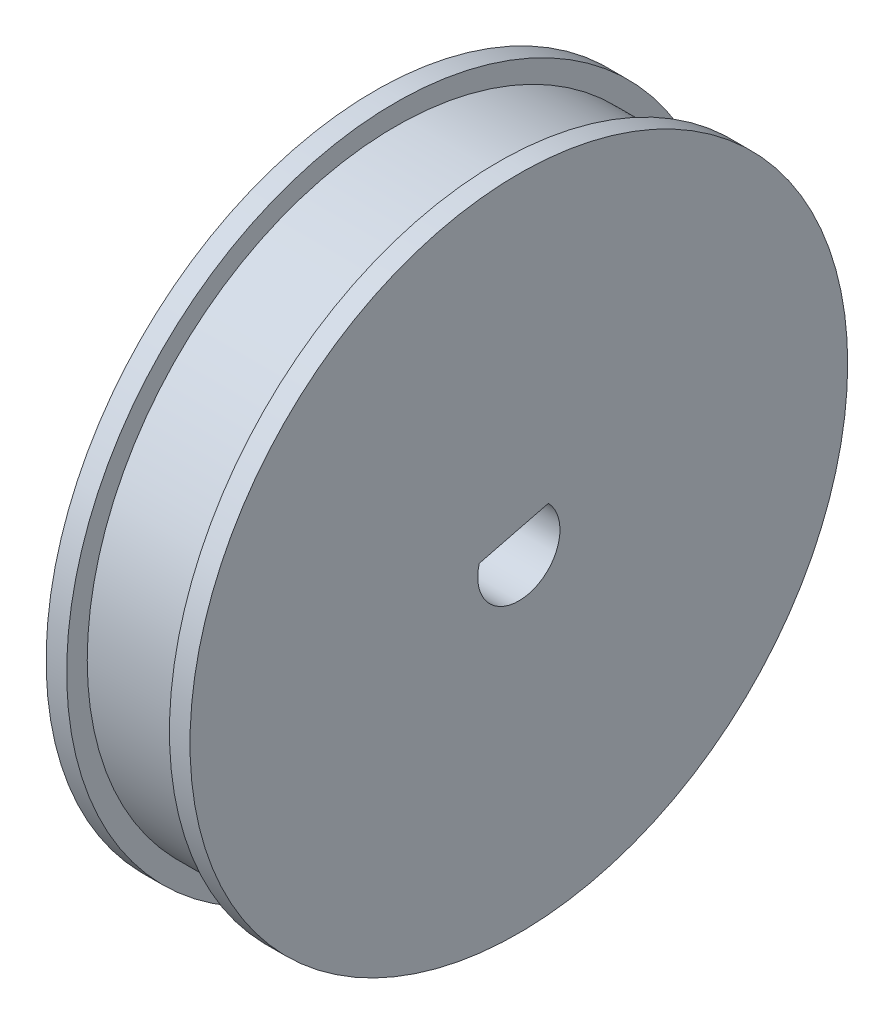
ISO-10303-21;
HEADER;
FILE_DESCRIPTION(('STEP AP214'),'2;1');
FILE_NAME('part.step','',(''),(''),'','','');
FILE_SCHEMA(('AUTOMOTIVE_DESIGN { 1 0 10303 214 1 1 1 1 }'));
ENDSEC;
DATA;
#1=APPLICATION_CONTEXT('core data for automotive mechanical design processes');
#2=APPLICATION_PROTOCOL_DEFINITION('international standard','automotive_design',2000,#1);
#3=PRODUCT_CONTEXT('',#1,'mechanical');
#4=PRODUCT('Part','Part','',(#3));
#5=PRODUCT_RELATED_PRODUCT_CATEGORY('part','',(#4));
#6=PRODUCT_DEFINITION_FORMATION('','',#4);
#7=PRODUCT_DEFINITION_CONTEXT('part definition',#1,'design');
#8=PRODUCT_DEFINITION('design','',#6,#7);
#9=PRODUCT_DEFINITION_SHAPE('','',#8);
#10=(LENGTH_UNIT() NAMED_UNIT(*) SI_UNIT(.MILLI.,.METRE.));
#11=(NAMED_UNIT(*) PLANE_ANGLE_UNIT() SI_UNIT($,.RADIAN.));
#12=(NAMED_UNIT(*) SI_UNIT($,.STERADIAN.) SOLID_ANGLE_UNIT());
#13=UNCERTAINTY_MEASURE_WITH_UNIT(LENGTH_MEASURE(1.E-05),#10,'distance_accuracy_value','');
#14=(GEOMETRIC_REPRESENTATION_CONTEXT(3) GLOBAL_UNCERTAINTY_ASSIGNED_CONTEXT((#13)) GLOBAL_UNIT_ASSIGNED_CONTEXT((#10,
#11,#12)) REPRESENTATION_CONTEXT('',''));
#15=CARTESIAN_POINT('',(0.,0.,0.));
#16=DIRECTION('',(0.,0.,1.));
#17=DIRECTION('',(1.,0.,0.));
#18=AXIS2_PLACEMENT_3D('',#15,#16,#17);
#19=CARTESIAN_POINT('',(7.,0.,0.));
#20=DIRECTION('',(-1.,0.,0.));
#21=DIRECTION('',(0.,0.,1.));
#22=AXIS2_PLACEMENT_3D('',#19,#20,#21);
#23=CYLINDRICAL_SURFACE('',#22,16.);
#24=CARTESIAN_POINT('',(0.,0.,0.));
#25=DIRECTION('',(1.,0.,0.));
#26=DIRECTION('',(0.,0.,-1.));
#27=AXIS2_PLACEMENT_3D('',#24,#25,#26);
#28=CIRCLE('',#27,16.);
#29=CARTESIAN_POINT('',(0.,0.,-16.));
#30=VERTEX_POINT('',#29);
#31=EDGE_CURVE('E45',#30,#30,#28,.T.);
#32=ORIENTED_EDGE('',*,*,#31,.T.);
#33=EDGE_LOOP('',(#32));
#34=FACE_BOUND('',#33,.T.);
#35=CARTESIAN_POINT('',(1.,0.,0.));
#36=DIRECTION('',(1.,0.,0.));
#37=DIRECTION('',(0.,0.,-1.));
#38=AXIS2_PLACEMENT_3D('',#35,#36,#37);
#39=CIRCLE('',#38,16.);
#40=CARTESIAN_POINT('',(1.,0.,-16.));
#41=VERTEX_POINT('',#40);
#42=EDGE_CURVE('E84',#41,#41,#39,.T.);
#43=ORIENTED_EDGE('',*,*,#42,.F.);
#44=EDGE_LOOP('',(#43));
#45=FACE_BOUND('',#44,.T.);
#46=ADVANCED_FACE('F41',(#34,#45),#23,.T.);
#47=CARTESIAN_POINT('',(7.,0.,0.));
#48=DIRECTION('',(1.,0.,0.));
#49=DIRECTION('',(0.,0.,-1.));
#50=AXIS2_PLACEMENT_3D('',#47,#48,#49);
#51=PLANE('',#50);
#52=CARTESIAN_POINT('',(7.,0.,0.));
#53=DIRECTION('',(1.,0.,0.));
#54=DIRECTION('',(0.,0.,-1.));
#55=AXIS2_PLACEMENT_3D('',#52,#53,#54);
#56=CIRCLE('',#55,16.);
#57=CARTESIAN_POINT('',(7.,0.,-16.));
#58=VERTEX_POINT('',#57);
#59=EDGE_CURVE('E11',#58,#58,#56,.T.);
#60=ORIENTED_EDGE('',*,*,#59,.T.);
#61=EDGE_LOOP('',(#60));
#62=FACE_BOUND('',#61,.T.);
#63=DIRECTION('',(0.,-0.244412301162042,0.969671401579254));
#64=VECTOR('',#63,1.);
#65=CARTESIAN_POINT('',(7.,0.546336877971772,1.92393243534383));
#66=LINE('',#65,#64);
#67=CARTESIAN_POINT('',(7.,1.39300592518674,-1.43510783301975));
#68=VERTEX_POINT('',#67);
#69=CARTESIAN_POINT('',(7.,0.546336877971772,1.92393243534383));
#70=VERTEX_POINT('',#69);
#71=EDGE_CURVE('E91',#68,#70,#66,.T.);
#72=ORIENTED_EDGE('',*,*,#71,.F.);
#73=CARTESIAN_POINT('',(7.,0.,0.));
#74=DIRECTION('',(1.,0.,0.));
#75=DIRECTION('',(0.,0.,-1.));
#76=AXIS2_PLACEMENT_3D('',#73,#74,#75);
#77=CIRCLE('',#76,2.);
#78=EDGE_CURVE('E75',#70,#68,#77,.T.);
#79=ORIENTED_EDGE('',*,*,#78,.F.);
#80=EDGE_LOOP('',(#72,#79));
#81=FACE_BOUND('',#80,.T.);
#82=ADVANCED_FACE('F121',(#62,#81),#51,.T.);
#83=CARTESIAN_POINT('',(0.,0.,0.));
#84=DIRECTION('',(1.,0.,0.));
#85=DIRECTION('',(0.,0.,-1.));
#86=AXIS2_PLACEMENT_3D('',#83,#84,#85);
#87=PLANE('',#86);
#88=ORIENTED_EDGE('',*,*,#31,.F.);
#89=EDGE_LOOP('',(#88));
#90=FACE_BOUND('',#89,.T.);
#91=CARTESIAN_POINT('',(0.,0.,0.));
#92=DIRECTION('',(1.,0.,0.));
#93=DIRECTION('',(0.,0.,-1.));
#94=AXIS2_PLACEMENT_3D('',#91,#92,#93);
#95=CIRCLE('',#94,2.);
#96=CARTESIAN_POINT('',(0.,0.546336877971772,1.92393243534383));
#97=VERTEX_POINT('',#96);
#98=CARTESIAN_POINT('',(0.,1.39300592518674,-1.43510783301975));
#99=VERTEX_POINT('',#98);
#100=EDGE_CURVE('E64',#97,#99,#95,.T.);
#101=ORIENTED_EDGE('',*,*,#100,.T.);
#102=DIRECTION('',(0.,-0.244412301162042,0.969671401579254));
#103=VECTOR('',#102,1.);
#104=CARTESIAN_POINT('',(0.,0.546336877971772,1.92393243534383));
#105=LINE('',#104,#103);
#106=EDGE_CURVE('E70',#99,#97,#105,.T.);
#107=ORIENTED_EDGE('',*,*,#106,.T.);
#108=EDGE_LOOP('',(#101,#107));
#109=FACE_BOUND('',#108,.T.);
#110=ADVANCED_FACE('F82',(#90,#109),#87,.F.);
#111=CARTESIAN_POINT('',(6.,0.,0.));
#112=DIRECTION('',(1.,0.,0.));
#113=DIRECTION('',(0.,0.,-1.));
#114=AXIS2_PLACEMENT_3D('',#111,#112,#113);
#115=CIRCLE('',#114,16.);
#116=CARTESIAN_POINT('',(6.,0.,-16.));
#117=VERTEX_POINT('',#116);
#118=EDGE_CURVE('E88',#117,#117,#115,.T.);
#119=ORIENTED_EDGE('',*,*,#118,.T.);
#120=EDGE_LOOP('',(#119));
#121=FACE_BOUND('',#120,.T.);
#122=ORIENTED_EDGE('',*,*,#59,.F.);
#123=EDGE_LOOP('',(#122));
#124=FACE_BOUND('',#123,.T.);
#125=ADVANCED_FACE('F43',(#121,#124),#23,.T.);
#126=CARTESIAN_POINT('',(7.,0.,0.));
#127=DIRECTION('',(-1.,0.,0.));
#128=DIRECTION('',(0.,0.,1.));
#129=AXIS2_PLACEMENT_3D('',#126,#127,#128);
#130=CYLINDRICAL_SURFACE('',#129,2.);
#131=ORIENTED_EDGE('',*,*,#100,.F.);
#132=DIRECTION('',(-1.,0.,0.));
#133=VECTOR('',#132,1.);
#134=CARTESIAN_POINT('',(7.,0.546336877971772,1.92393243534383));
#135=LINE('',#134,#133);
#136=EDGE_CURVE('E72',#70,#97,#135,.T.);
#137=ORIENTED_EDGE('',*,*,#136,.F.);
#138=ORIENTED_EDGE('',*,*,#78,.T.);
#139=DIRECTION('',(-1.,0.,0.));
#140=VECTOR('',#139,1.);
#141=CARTESIAN_POINT('',(7.,1.39300592518674,-1.43510783301975));
#142=LINE('',#141,#140);
#143=EDGE_CURVE('E57',#68,#99,#142,.T.);
#144=ORIENTED_EDGE('',*,*,#143,.T.);
#145=EDGE_LOOP('',(#131,#137,#138,#144));
#146=FACE_BOUND('',#145,.T.);
#147=ADVANCED_FACE('F77',(#146),#130,.F.);
#148=CARTESIAN_POINT('',(7.,0.546336877971772,1.92393243534383));
#149=DIRECTION('',(0.,-0.969671401579254,-0.244412301162042));
#150=DIRECTION('',(0.,0.244412301162042,-0.969671401579254));
#151=AXIS2_PLACEMENT_3D('',#148,#149,#150);
#152=PLANE('',#151);
#153=ORIENTED_EDGE('',*,*,#106,.F.);
#154=ORIENTED_EDGE('',*,*,#143,.F.);
#155=ORIENTED_EDGE('',*,*,#71,.T.);
#156=ORIENTED_EDGE('',*,*,#136,.T.);
#157=EDGE_LOOP('',(#153,#154,#155,#156));
#158=FACE_BOUND('',#157,.T.);
#159=ADVANCED_FACE('F71',(#158),#152,.T.);
#160=CARTESIAN_POINT('',(1.,0.,0.));
#161=DIRECTION('',(1.,0.,0.));
#162=DIRECTION('',(0.,0.,-1.));
#163=AXIS2_PLACEMENT_3D('',#160,#161,#162);
#164=PLANE('',#163);
#165=CARTESIAN_POINT('',(1.,0.,0.));
#166=DIRECTION('',(1.,0.,0.));
#167=DIRECTION('',(0.,0.,-1.));
#168=AXIS2_PLACEMENT_3D('',#165,#166,#167);
#169=CIRCLE('',#168,15.);
#170=CARTESIAN_POINT('',(1.,0.,-15.));
#171=VERTEX_POINT('',#170);
#172=EDGE_CURVE('E100',#171,#171,#169,.T.);
#173=ORIENTED_EDGE('',*,*,#172,.F.);
#174=EDGE_LOOP('',(#173));
#175=FACE_BOUND('',#174,.T.);
#176=ORIENTED_EDGE('',*,*,#42,.T.);
#177=EDGE_LOOP('',(#176));
#178=FACE_BOUND('',#177,.T.);
#179=ADVANCED_FACE('F113',(#175,#178),#164,.T.);
#180=CARTESIAN_POINT('',(6.,0.,0.));
#181=DIRECTION('',(1.,0.,0.));
#182=DIRECTION('',(0.,0.,-1.));
#183=AXIS2_PLACEMENT_3D('',#180,#181,#182);
#184=PLANE('',#183);
#185=CARTESIAN_POINT('',(6.,0.,0.));
#186=DIRECTION('',(1.,0.,0.));
#187=DIRECTION('',(0.,0.,-1.));
#188=AXIS2_PLACEMENT_3D('',#185,#186,#187);
#189=CIRCLE('',#188,15.);
#190=CARTESIAN_POINT('',(6.,0.,-15.));
#191=VERTEX_POINT('',#190);
#192=EDGE_CURVE('E102',#191,#191,#189,.T.);
#193=ORIENTED_EDGE('',*,*,#192,.T.);
#194=EDGE_LOOP('',(#193));
#195=FACE_BOUND('',#194,.T.);
#196=ORIENTED_EDGE('',*,*,#118,.F.);
#197=EDGE_LOOP('',(#196));
#198=FACE_BOUND('',#197,.T.);
#199=ADVANCED_FACE('F116',(#195,#198),#184,.F.);
#200=CARTESIAN_POINT('',(1.,0.,0.));
#201=DIRECTION('',(1.,0.,0.));
#202=DIRECTION('',(0.,0.,-1.));
#203=AXIS2_PLACEMENT_3D('',#200,#201,#202);
#204=CYLINDRICAL_SURFACE('',#203,15.);
#205=ORIENTED_EDGE('',*,*,#172,.T.);
#206=EDGE_LOOP('',(#205));
#207=FACE_BOUND('',#206,.T.);
#208=ORIENTED_EDGE('',*,*,#192,.F.);
#209=EDGE_LOOP('',(#208));
#210=FACE_BOUND('',#209,.T.);
#211=ADVANCED_FACE('F110',(#207,#210),#204,.T.);
#212=CLOSED_SHELL('',(#46,#82,#110,#125,#147,#159,#179,#199,#211));
#213=MANIFOLD_SOLID_BREP('B2',#212);
#214=ADVANCED_BREP_SHAPE_REPRESENTATION('',(#18,#213),#14);
#215=SHAPE_DEFINITION_REPRESENTATION(#9,#214);
ENDSEC;
END-ISO-10303-21;
